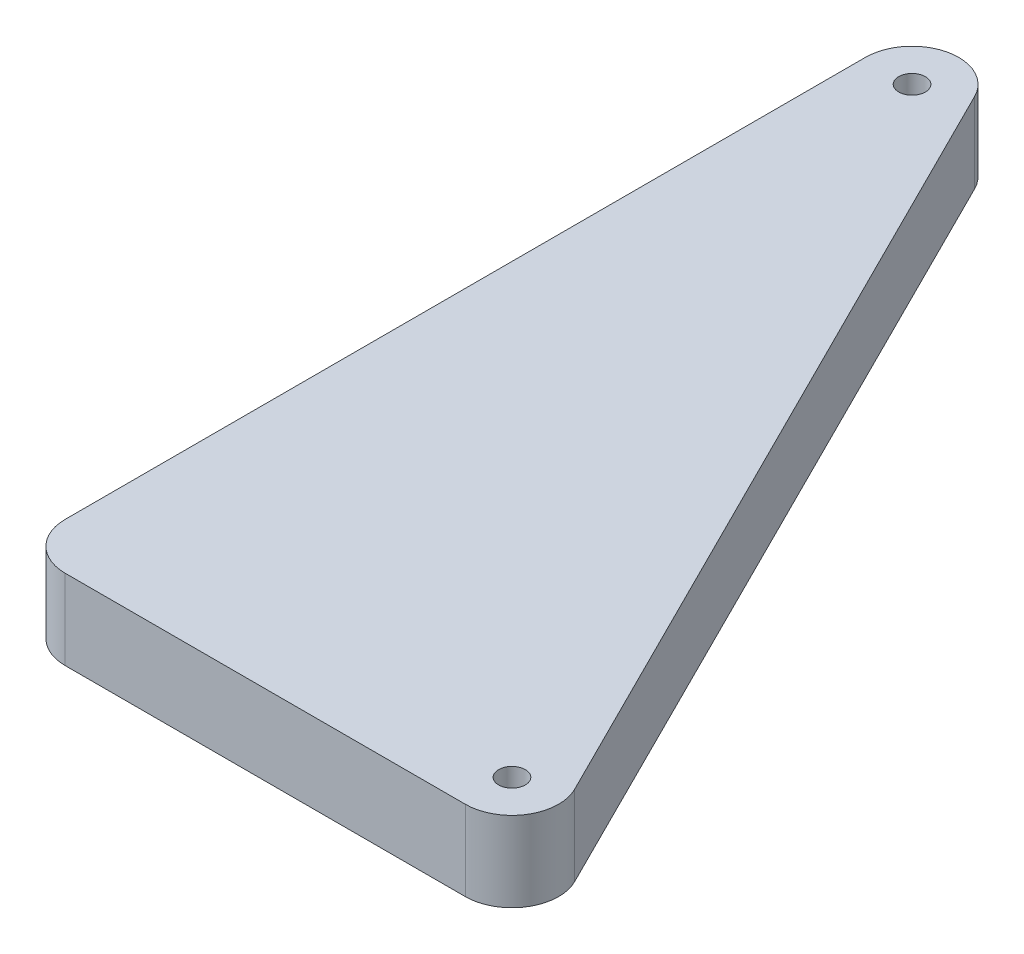
ISO-10303-21;
HEADER;
FILE_DESCRIPTION(('STEP AP214'),'2;1');
FILE_NAME('part.step','',(''),(''),'','','');
FILE_SCHEMA(('AUTOMOTIVE_DESIGN { 1 0 10303 214 1 1 1 1 }'));
ENDSEC;
DATA;
#1=APPLICATION_CONTEXT('core data for automotive mechanical design processes');
#2=APPLICATION_PROTOCOL_DEFINITION('international standard','automotive_design',2000,#1);
#3=PRODUCT_CONTEXT('',#1,'mechanical');
#4=PRODUCT('Part','Part','',(#3));
#5=PRODUCT_RELATED_PRODUCT_CATEGORY('part','',(#4));
#6=PRODUCT_DEFINITION_FORMATION('','',#4);
#7=PRODUCT_DEFINITION_CONTEXT('part definition',#1,'design');
#8=PRODUCT_DEFINITION('design','',#6,#7);
#9=PRODUCT_DEFINITION_SHAPE('','',#8);
#10=(LENGTH_UNIT() NAMED_UNIT(*) SI_UNIT(.MILLI.,.METRE.));
#11=(NAMED_UNIT(*) PLANE_ANGLE_UNIT() SI_UNIT($,.RADIAN.));
#12=(NAMED_UNIT(*) SI_UNIT($,.STERADIAN.) SOLID_ANGLE_UNIT());
#13=UNCERTAINTY_MEASURE_WITH_UNIT(LENGTH_MEASURE(1.E-05),#10,'distance_accuracy_value','');
#14=(GEOMETRIC_REPRESENTATION_CONTEXT(3) GLOBAL_UNCERTAINTY_ASSIGNED_CONTEXT((#13)) GLOBAL_UNIT_ASSIGNED_CONTEXT((#10,
#11,#12)) REPRESENTATION_CONTEXT('',''));
#15=CARTESIAN_POINT('',(0.,0.,0.));
#16=DIRECTION('',(0.,0.,1.));
#17=DIRECTION('',(1.,0.,0.));
#18=AXIS2_PLACEMENT_3D('',#15,#16,#17);
#19=CARTESIAN_POINT('',(30.,6.,60.));
#20=DIRECTION('',(0.,1.,0.));
#21=DIRECTION('',(0.,0.,1.));
#22=AXIS2_PLACEMENT_3D('',#19,#20,#21);
#23=PLANE('',#22);
#24=CARTESIAN_POINT('',(0.,6.,0.));
#25=DIRECTION('',(0.,1.,0.));
#26=DIRECTION('',(0.,0.,1.));
#27=AXIS2_PLACEMENT_3D('',#24,#25,#26);
#28=CIRCLE('',#27,1.);
#29=CARTESIAN_POINT('',(0.,6.,1.));
#30=VERTEX_POINT('',#29);
#31=EDGE_CURVE('E120',#30,#30,#28,.T.);
#32=ORIENTED_EDGE('',*,*,#31,.F.);
#33=EDGE_LOOP('',(#32));
#34=FACE_BOUND('',#33,.T.);
#35=CARTESIAN_POINT('',(30.,6.,60.));
#36=DIRECTION('',(0.,1.,0.));
#37=DIRECTION('',(0.,0.,1.));
#38=AXIS2_PLACEMENT_3D('',#35,#36,#37);
#39=CIRCLE('',#38,3.5);
#40=CARTESIAN_POINT('',(30.,6.,63.5));
#41=VERTEX_POINT('',#40);
#42=CARTESIAN_POINT('',(33.1304951684997,6.,58.4347524157501));
#43=VERTEX_POINT('',#42);
#44=EDGE_CURVE('E127',#41,#43,#39,.T.);
#45=ORIENTED_EDGE('',*,*,#44,.T.);
#46=DIRECTION('',(-0.447213595499958,0.,-0.894427190999916));
#47=VECTOR('',#46,1.);
#48=CARTESIAN_POINT('',(3.1304951684997,6.,-1.56524758424985));
#49=LINE('',#48,#47);
#50=CARTESIAN_POINT('',(3.1304951684997,6.,-1.56524758424985));
#51=VERTEX_POINT('',#50);
#52=EDGE_CURVE('E85',#43,#51,#49,.T.);
#53=ORIENTED_EDGE('',*,*,#52,.T.);
#54=CARTESIAN_POINT('',(0.,6.,0.));
#55=DIRECTION('',(0.,1.,0.));
#56=DIRECTION('',(0.,0.,1.));
#57=AXIS2_PLACEMENT_3D('',#54,#55,#56);
#58=CIRCLE('',#57,3.5);
#59=CARTESIAN_POINT('',(-3.5,6.,0.));
#60=VERTEX_POINT('',#59);
#61=EDGE_CURVE('E98',#51,#60,#58,.T.);
#62=ORIENTED_EDGE('',*,*,#61,.T.);
#63=DIRECTION('',(0.,0.,1.));
#64=VECTOR('',#63,1.);
#65=CARTESIAN_POINT('',(-3.5,6.,60.));
#66=LINE('',#65,#64);
#67=CARTESIAN_POINT('',(-3.5,6.,60.));
#68=VERTEX_POINT('',#67);
#69=EDGE_CURVE('E92',#60,#68,#66,.T.);
#70=ORIENTED_EDGE('',*,*,#69,.T.);
#71=CARTESIAN_POINT('',(0.,6.,60.));
#72=DIRECTION('',(0.,1.,0.));
#73=DIRECTION('',(0.,0.,1.));
#74=AXIS2_PLACEMENT_3D('',#71,#72,#73);
#75=CIRCLE('',#74,3.5);
#76=CARTESIAN_POINT('',(0.,6.,63.5));
#77=VERTEX_POINT('',#76);
#78=EDGE_CURVE('E96',#68,#77,#75,.T.);
#79=ORIENTED_EDGE('',*,*,#78,.T.);
#80=DIRECTION('',(1.,0.,0.));
#81=VECTOR('',#80,1.);
#82=CARTESIAN_POINT('',(30.,6.,63.5));
#83=LINE('',#82,#81);
#84=EDGE_CURVE('E48',#77,#41,#83,.T.);
#85=ORIENTED_EDGE('',*,*,#84,.T.);
#86=EDGE_LOOP('',(#45,#53,#62,#70,#79,#85));
#87=FACE_BOUND('',#86,.T.);
#88=CARTESIAN_POINT('',(30.,6.,60.));
#89=DIRECTION('',(0.,1.,0.));
#90=DIRECTION('',(0.,0.,1.));
#91=AXIS2_PLACEMENT_3D('',#88,#89,#90);
#92=CIRCLE('',#91,1.);
#93=CARTESIAN_POINT('',(30.,6.,61.));
#94=VERTEX_POINT('',#93);
#95=EDGE_CURVE('E170',#94,#94,#92,.T.);
#96=ORIENTED_EDGE('',*,*,#95,.F.);
#97=EDGE_LOOP('',(#96));
#98=FACE_BOUND('',#97,.T.);
#99=ADVANCED_FACE('F31',(#34,#87,#98),#23,.T.);
#100=CARTESIAN_POINT('',(30.,0.,60.));
#101=DIRECTION('',(0.,1.,0.));
#102=DIRECTION('',(0.,0.,1.));
#103=AXIS2_PLACEMENT_3D('',#100,#101,#102);
#104=PLANE('',#103);
#105=CARTESIAN_POINT('',(0.,0.,0.));
#106=DIRECTION('',(0.,1.,0.));
#107=DIRECTION('',(0.,0.,1.));
#108=AXIS2_PLACEMENT_3D('',#105,#106,#107);
#109=CIRCLE('',#108,1.);
#110=CARTESIAN_POINT('',(0.,0.,1.));
#111=VERTEX_POINT('',#110);
#112=EDGE_CURVE('E175',#111,#111,#109,.T.);
#113=ORIENTED_EDGE('',*,*,#112,.T.);
#114=EDGE_LOOP('',(#113));
#115=FACE_BOUND('',#114,.T.);
#116=CARTESIAN_POINT('',(30.,0.,60.));
#117=DIRECTION('',(0.,1.,0.));
#118=DIRECTION('',(0.,0.,1.));
#119=AXIS2_PLACEMENT_3D('',#116,#117,#118);
#120=CIRCLE('',#119,3.5);
#121=CARTESIAN_POINT('',(30.,0.,63.5));
#122=VERTEX_POINT('',#121);
#123=CARTESIAN_POINT('',(33.1304951684997,0.,58.4347524157501));
#124=VERTEX_POINT('',#123);
#125=EDGE_CURVE('E116',#122,#124,#120,.T.);
#126=ORIENTED_EDGE('',*,*,#125,.F.);
#127=DIRECTION('',(1.,0.,0.));
#128=VECTOR('',#127,1.);
#129=CARTESIAN_POINT('',(30.,0.,63.5));
#130=LINE('',#129,#128);
#131=CARTESIAN_POINT('',(0.,0.,63.5));
#132=VERTEX_POINT('',#131);
#133=EDGE_CURVE('E77',#132,#122,#130,.T.);
#134=ORIENTED_EDGE('',*,*,#133,.F.);
#135=CARTESIAN_POINT('',(0.,0.,60.));
#136=DIRECTION('',(0.,1.,0.));
#137=DIRECTION('',(0.,0.,1.));
#138=AXIS2_PLACEMENT_3D('',#135,#136,#137);
#139=CIRCLE('',#138,3.5);
#140=CARTESIAN_POINT('',(-3.5,0.,60.));
#141=VERTEX_POINT('',#140);
#142=EDGE_CURVE('E71',#141,#132,#139,.T.);
#143=ORIENTED_EDGE('',*,*,#142,.F.);
#144=DIRECTION('',(0.,0.,1.));
#145=VECTOR('',#144,1.);
#146=CARTESIAN_POINT('',(-3.5,0.,60.));
#147=LINE('',#146,#145);
#148=CARTESIAN_POINT('',(-3.5,0.,0.));
#149=VERTEX_POINT('',#148);
#150=EDGE_CURVE('E106',#149,#141,#147,.T.);
#151=ORIENTED_EDGE('',*,*,#150,.F.);
#152=CARTESIAN_POINT('',(0.,0.,0.));
#153=DIRECTION('',(0.,1.,0.));
#154=DIRECTION('',(0.,0.,1.));
#155=AXIS2_PLACEMENT_3D('',#152,#153,#154);
#156=CIRCLE('',#155,3.5);
#157=CARTESIAN_POINT('',(3.1304951684997,0.,-1.56524758424985));
#158=VERTEX_POINT('',#157);
#159=EDGE_CURVE('E122',#158,#149,#156,.T.);
#160=ORIENTED_EDGE('',*,*,#159,.F.);
#161=DIRECTION('',(-0.447213595499958,0.,-0.894427190999916));
#162=VECTOR('',#161,1.);
#163=CARTESIAN_POINT('',(3.1304951684997,0.,-1.56524758424985));
#164=LINE('',#163,#162);
#165=EDGE_CURVE('E119',#124,#158,#164,.T.);
#166=ORIENTED_EDGE('',*,*,#165,.F.);
#167=EDGE_LOOP('',(#126,#134,#143,#151,#160,#166));
#168=FACE_BOUND('',#167,.T.);
#169=CARTESIAN_POINT('',(30.,0.,60.));
#170=DIRECTION('',(0.,1.,0.));
#171=DIRECTION('',(0.,0.,1.));
#172=AXIS2_PLACEMENT_3D('',#169,#170,#171);
#173=CIRCLE('',#172,1.);
#174=CARTESIAN_POINT('',(30.,0.,61.));
#175=VERTEX_POINT('',#174);
#176=EDGE_CURVE('E173',#175,#175,#173,.T.);
#177=ORIENTED_EDGE('',*,*,#176,.T.);
#178=EDGE_LOOP('',(#177));
#179=FACE_BOUND('',#178,.T.);
#180=ADVANCED_FACE('F136',(#115,#168,#179),#104,.F.);
#181=CARTESIAN_POINT('',(30.,6.,60.));
#182=DIRECTION('',(0.,-1.,0.));
#183=DIRECTION('',(0.,0.,-1.));
#184=AXIS2_PLACEMENT_3D('',#181,#182,#183);
#185=CYLINDRICAL_SURFACE('',#184,3.5);
#186=ORIENTED_EDGE('',*,*,#125,.T.);
#187=DIRECTION('',(0.,-1.,0.));
#188=VECTOR('',#187,1.);
#189=CARTESIAN_POINT('',(33.1304951684997,6.,58.4347524157501));
#190=LINE('',#189,#188);
#191=EDGE_CURVE('E11',#43,#124,#190,.T.);
#192=ORIENTED_EDGE('',*,*,#191,.F.);
#193=ORIENTED_EDGE('',*,*,#44,.F.);
#194=DIRECTION('',(0.,-1.,0.));
#195=VECTOR('',#194,1.);
#196=CARTESIAN_POINT('',(30.,6.,63.5));
#197=LINE('',#196,#195);
#198=EDGE_CURVE('E112',#41,#122,#197,.T.);
#199=ORIENTED_EDGE('',*,*,#198,.T.);
#200=EDGE_LOOP('',(#186,#192,#193,#199));
#201=FACE_BOUND('',#200,.T.);
#202=ADVANCED_FACE('F33',(#201),#185,.T.);
#203=CARTESIAN_POINT('',(3.1304951684997,6.,-1.56524758424985));
#204=DIRECTION('',(-0.894427190999916,0.,0.447213595499958));
#205=DIRECTION('',(0.447213595499958,0.,0.894427190999916));
#206=AXIS2_PLACEMENT_3D('',#203,#204,#205);
#207=PLANE('',#206);
#208=ORIENTED_EDGE('',*,*,#165,.T.);
#209=DIRECTION('',(0.,-1.,0.));
#210=VECTOR('',#209,1.);
#211=CARTESIAN_POINT('',(3.1304951684997,6.,-1.56524758424985));
#212=LINE('',#211,#210);
#213=EDGE_CURVE('E40',#51,#158,#212,.T.);
#214=ORIENTED_EDGE('',*,*,#213,.F.);
#215=ORIENTED_EDGE('',*,*,#52,.F.);
#216=ORIENTED_EDGE('',*,*,#191,.T.);
#217=EDGE_LOOP('',(#208,#214,#215,#216));
#218=FACE_BOUND('',#217,.T.);
#219=ADVANCED_FACE('F216',(#218),#207,.F.);
#220=CARTESIAN_POINT('',(0.,6.,0.));
#221=DIRECTION('',(0.,-1.,0.));
#222=DIRECTION('',(0.,0.,-1.));
#223=AXIS2_PLACEMENT_3D('',#220,#221,#222);
#224=CYLINDRICAL_SURFACE('',#223,3.5);
#225=ORIENTED_EDGE('',*,*,#159,.T.);
#226=DIRECTION('',(0.,-1.,0.));
#227=VECTOR('',#226,1.);
#228=CARTESIAN_POINT('',(-3.5,6.,0.));
#229=LINE('',#228,#227);
#230=EDGE_CURVE('E107',#60,#149,#229,.T.);
#231=ORIENTED_EDGE('',*,*,#230,.F.);
#232=ORIENTED_EDGE('',*,*,#61,.F.);
#233=ORIENTED_EDGE('',*,*,#213,.T.);
#234=EDGE_LOOP('',(#225,#231,#232,#233));
#235=FACE_BOUND('',#234,.T.);
#236=ADVANCED_FACE('F133',(#235),#224,.T.);
#237=CARTESIAN_POINT('',(-3.5,6.,60.));
#238=DIRECTION('',(1.,0.,0.));
#239=DIRECTION('',(0.,0.,-1.));
#240=AXIS2_PLACEMENT_3D('',#237,#238,#239);
#241=PLANE('',#240);
#242=ORIENTED_EDGE('',*,*,#150,.T.);
#243=DIRECTION('',(0.,-1.,0.));
#244=VECTOR('',#243,1.);
#245=CARTESIAN_POINT('',(-3.5,6.,60.));
#246=LINE('',#245,#244);
#247=EDGE_CURVE('E103',#68,#141,#246,.T.);
#248=ORIENTED_EDGE('',*,*,#247,.F.);
#249=ORIENTED_EDGE('',*,*,#69,.F.);
#250=ORIENTED_EDGE('',*,*,#230,.T.);
#251=EDGE_LOOP('',(#242,#248,#249,#250));
#252=FACE_BOUND('',#251,.T.);
#253=ADVANCED_FACE('F104',(#252),#241,.F.);
#254=CARTESIAN_POINT('',(0.,6.,60.));
#255=DIRECTION('',(0.,-1.,0.));
#256=DIRECTION('',(0.,0.,-1.));
#257=AXIS2_PLACEMENT_3D('',#254,#255,#256);
#258=CYLINDRICAL_SURFACE('',#257,3.5);
#259=ORIENTED_EDGE('',*,*,#142,.T.);
#260=DIRECTION('',(0.,-1.,0.));
#261=VECTOR('',#260,1.);
#262=CARTESIAN_POINT('',(0.,6.,63.5));
#263=LINE('',#262,#261);
#264=EDGE_CURVE('E108',#77,#132,#263,.T.);
#265=ORIENTED_EDGE('',*,*,#264,.F.);
#266=ORIENTED_EDGE('',*,*,#78,.F.);
#267=ORIENTED_EDGE('',*,*,#247,.T.);
#268=EDGE_LOOP('',(#259,#265,#266,#267));
#269=FACE_BOUND('',#268,.T.);
#270=ADVANCED_FACE('F110',(#269),#258,.T.);
#271=CARTESIAN_POINT('',(30.,6.,63.5));
#272=DIRECTION('',(0.,0.,-1.));
#273=DIRECTION('',(-1.,0.,0.));
#274=AXIS2_PLACEMENT_3D('',#271,#272,#273);
#275=PLANE('',#274);
#276=ORIENTED_EDGE('',*,*,#133,.T.);
#277=ORIENTED_EDGE('',*,*,#198,.F.);
#278=ORIENTED_EDGE('',*,*,#84,.F.);
#279=ORIENTED_EDGE('',*,*,#264,.T.);
#280=EDGE_LOOP('',(#276,#277,#278,#279));
#281=FACE_BOUND('',#280,.T.);
#282=ADVANCED_FACE('F141',(#281),#275,.F.);
#283=CARTESIAN_POINT('',(0.,6.,0.));
#284=DIRECTION('',(0.,-1.,0.));
#285=DIRECTION('',(0.,0.,-1.));
#286=AXIS2_PLACEMENT_3D('',#283,#284,#285);
#287=CYLINDRICAL_SURFACE('',#286,1.);
#288=ORIENTED_EDGE('',*,*,#31,.T.);
#289=EDGE_LOOP('',(#288));
#290=FACE_BOUND('',#289,.T.);
#291=ORIENTED_EDGE('',*,*,#112,.F.);
#292=EDGE_LOOP('',(#291));
#293=FACE_BOUND('',#292,.T.);
#294=ADVANCED_FACE('F143',(#290,#293),#287,.F.);
#295=CARTESIAN_POINT('',(30.,6.,60.));
#296=DIRECTION('',(0.,-1.,0.));
#297=DIRECTION('',(0.,0.,-1.));
#298=AXIS2_PLACEMENT_3D('',#295,#296,#297);
#299=CYLINDRICAL_SURFACE('',#298,1.);
#300=ORIENTED_EDGE('',*,*,#95,.T.);
#301=EDGE_LOOP('',(#300));
#302=FACE_BOUND('',#301,.T.);
#303=ORIENTED_EDGE('',*,*,#176,.F.);
#304=EDGE_LOOP('',(#303));
#305=FACE_BOUND('',#304,.T.);
#306=ADVANCED_FACE('F149',(#302,#305),#299,.F.);
#307=CLOSED_SHELL('',(#99,#180,#202,#219,#236,#253,#270,#282,#294,#306));
#308=MANIFOLD_SOLID_BREP('B2',#307);
#309=ADVANCED_BREP_SHAPE_REPRESENTATION('',(#18,#308),#14);
#310=SHAPE_DEFINITION_REPRESENTATION(#9,#309);
ENDSEC;
END-ISO-10303-21;
